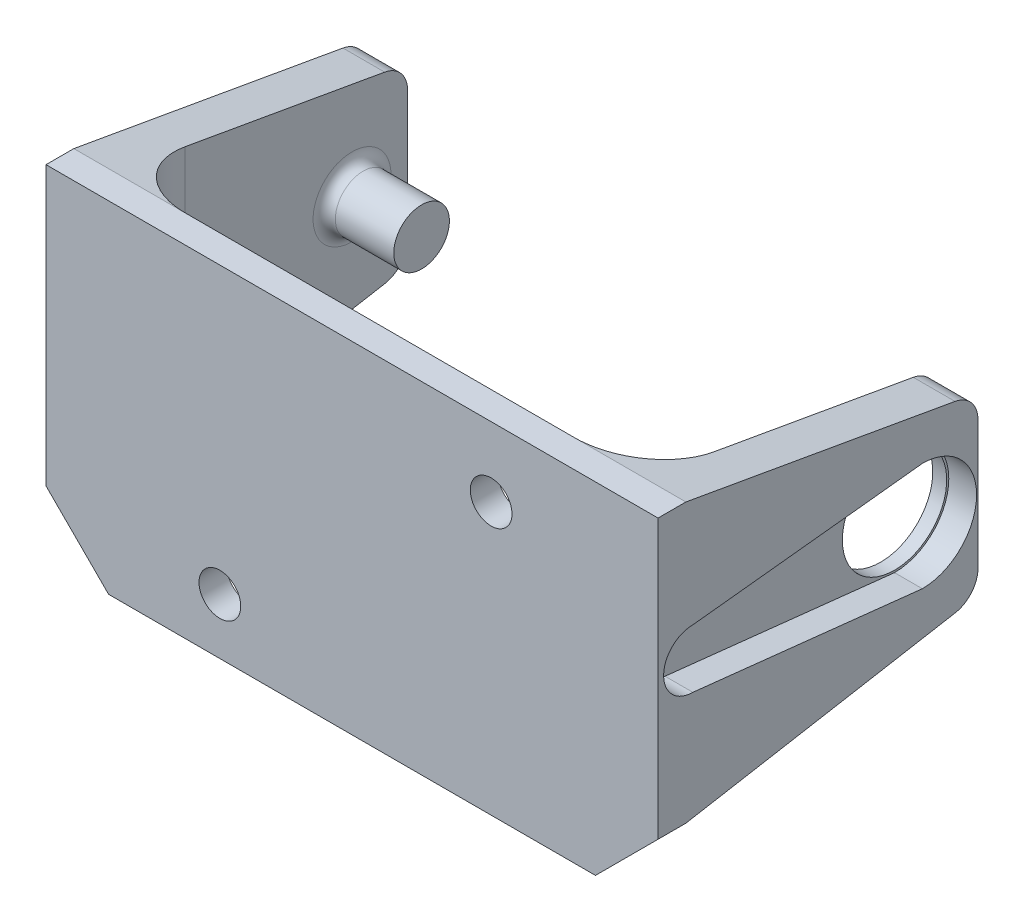
ISO-10303-21;
HEADER;
FILE_DESCRIPTION(('STEP AP214'),'2;1');
FILE_NAME('part.step','',(''),(''),'','','');
FILE_SCHEMA(('AUTOMOTIVE_DESIGN { 1 0 10303 214 1 1 1 1 }'));
ENDSEC;
DATA;
#1=APPLICATION_CONTEXT('core data for automotive mechanical design processes');
#2=APPLICATION_PROTOCOL_DEFINITION('international standard','automotive_design',2000,#1);
#3=PRODUCT_CONTEXT('',#1,'mechanical');
#4=PRODUCT('Part','Part','',(#3));
#5=PRODUCT_RELATED_PRODUCT_CATEGORY('part','',(#4));
#6=PRODUCT_DEFINITION_FORMATION('','',#4);
#7=PRODUCT_DEFINITION_CONTEXT('part definition',#1,'design');
#8=PRODUCT_DEFINITION('design','',#6,#7);
#9=PRODUCT_DEFINITION_SHAPE('','',#8);
#10=(LENGTH_UNIT() NAMED_UNIT(*) SI_UNIT(.MILLI.,.METRE.));
#11=(NAMED_UNIT(*) PLANE_ANGLE_UNIT() SI_UNIT($,.RADIAN.));
#12=(NAMED_UNIT(*) SI_UNIT($,.STERADIAN.) SOLID_ANGLE_UNIT());
#13=UNCERTAINTY_MEASURE_WITH_UNIT(LENGTH_MEASURE(1.E-05),#10,'distance_accuracy_value','');
#14=(GEOMETRIC_REPRESENTATION_CONTEXT(3) GLOBAL_UNCERTAINTY_ASSIGNED_CONTEXT((#13)) GLOBAL_UNIT_ASSIGNED_CONTEXT((#10,
#11,#12)) REPRESENTATION_CONTEXT('',''));
#15=CARTESIAN_POINT('',(0.,0.,0.));
#16=DIRECTION('',(0.,0.,1.));
#17=DIRECTION('',(1.,0.,0.));
#18=AXIS2_PLACEMENT_3D('',#15,#16,#17);
#19=CARTESIAN_POINT('',(22.,4.61893414276776,-19.));
#20=DIRECTION('',(-1.,0.,0.));
#21=DIRECTION('',(0.,0.,1.));
#22=AXIS2_PLACEMENT_3D('',#19,#20,#21);
#23=PLANE('',#22);
#24=DIRECTION('',(0.,-1.,0.));
#25=VECTOR('',#24,1.);
#26=CARTESIAN_POINT('',(22.,-10.,2.));
#27=LINE('',#26,#25);
#28=CARTESIAN_POINT('',(22.,10.,2.));
#29=VERTEX_POINT('',#28);
#30=CARTESIAN_POINT('',(22.,-10.,2.));
#31=VERTEX_POINT('',#30);
#32=EDGE_CURVE('E172',#29,#31,#27,.T.);
#33=ORIENTED_EDGE('',*,*,#32,.T.);
#34=DIRECTION('',(0.,0.,-1.));
#35=VECTOR('',#34,1.);
#36=CARTESIAN_POINT('',(22.,-10.,0.));
#37=LINE('',#36,#35);
#38=CARTESIAN_POINT('',(22.,-10.,0.));
#39=VERTEX_POINT('',#38);
#40=EDGE_CURVE('E255',#31,#39,#37,.T.);
#41=ORIENTED_EDGE('',*,*,#40,.T.);
#42=DIRECTION('',(0.,0.173648177666927,-0.984807753012209));
#43=VECTOR('',#42,1.);
#44=CARTESIAN_POINT('',(22.,-6.58854964879215,-19.3472963553338));
#45=LINE('',#44,#43);
#46=CARTESIAN_POINT('',(22.,-6.58854964879215,-19.3472963553338));
#47=VERTEX_POINT('',#46);
#48=EDGE_CURVE('E252',#39,#47,#45,.T.);
#49=ORIENTED_EDGE('',*,*,#48,.T.);
#50=CARTESIAN_POINT('',(22.,-4.61893414276774,-19.));
#51=DIRECTION('',(1.,0.,0.));
#52=DIRECTION('',(0.,0.,1.));
#53=AXIS2_PLACEMENT_3D('',#50,#51,#52);
#54=CIRCLE('',#53,2.);
#55=CARTESIAN_POINT('',(22.,-4.61893414276774,-21.));
#56=VERTEX_POINT('',#55);
#57=EDGE_CURVE('E249',#47,#56,#54,.T.);
#58=ORIENTED_EDGE('',*,*,#57,.T.);
#59=DIRECTION('',(0.,1.,0.));
#60=VECTOR('',#59,1.);
#61=CARTESIAN_POINT('',(22.,4.61893414276776,-21.));
#62=LINE('',#61,#60);
#63=CARTESIAN_POINT('',(22.,4.61893414276776,-21.));
#64=VERTEX_POINT('',#63);
#65=EDGE_CURVE('E246',#56,#64,#62,.T.);
#66=ORIENTED_EDGE('',*,*,#65,.T.);
#67=CARTESIAN_POINT('',(22.,4.61893414276776,-19.));
#68=DIRECTION('',(1.,0.,0.));
#69=DIRECTION('',(0.,0.,1.));
#70=AXIS2_PLACEMENT_3D('',#67,#68,#69);
#71=CIRCLE('',#70,2.);
#72=CARTESIAN_POINT('',(22.,6.58854964879218,-19.3472963553338));
#73=VERTEX_POINT('',#72);
#74=EDGE_CURVE('E243',#64,#73,#71,.T.);
#75=ORIENTED_EDGE('',*,*,#74,.T.);
#76=DIRECTION('',(0.,0.173648177666926,0.984807753012209));
#77=VECTOR('',#76,1.);
#78=CARTESIAN_POINT('',(22.,10.,0.));
#79=LINE('',#78,#77);
#80=CARTESIAN_POINT('',(22.,10.,0.));
#81=VERTEX_POINT('',#80);
#82=EDGE_CURVE('E240',#73,#81,#79,.T.);
#83=ORIENTED_EDGE('',*,*,#82,.T.);
#84=DIRECTION('',(0.,0.,1.));
#85=VECTOR('',#84,1.);
#86=CARTESIAN_POINT('',(22.,10.,2.));
#87=LINE('',#86,#85);
#88=EDGE_CURVE('E166',#81,#29,#87,.T.);
#89=ORIENTED_EDGE('',*,*,#88,.T.);
#90=EDGE_LOOP('',(#33,#41,#49,#58,#66,#75,#83,#89));
#91=FACE_BOUND('',#90,.T.);
#92=DIRECTION('',(0.,-0.108447510175418,-0.994102176607995));
#93=VECTOR('',#92,1.);
#94=CARTESIAN_POINT('',(22.,-2.02139823587063,0.220516171185887));
#95=LINE('',#94,#93);
#96=CARTESIAN_POINT('',(22.,-2.1,-0.499999999999997));
#97=VERTEX_POINT('',#96);
#98=CARTESIAN_POINT('',(22.,-3.9,-17.));
#99=VERTEX_POINT('',#98);
#100=EDGE_CURVE('E321',#97,#99,#95,.T.);
#101=ORIENTED_EDGE('',*,*,#100,.F.);
#102=CARTESIAN_POINT('',(22.,0.,-0.499999999999997));
#103=DIRECTION('',(-1.,0.,0.));
#104=DIRECTION('',(0.,0.,1.));
#105=AXIS2_PLACEMENT_3D('',#102,#103,#104);
#106=CIRCLE('',#105,2.1);
#107=CARTESIAN_POINT('',(22.,2.1,-0.499999999999997));
#108=VERTEX_POINT('',#107);
#109=EDGE_CURVE('E340',#97,#108,#106,.T.);
#110=ORIENTED_EDGE('',*,*,#109,.T.);
#111=DIRECTION('',(0.,-0.108447510175418,0.994102176607995));
#112=VECTOR('',#111,1.);
#113=CARTESIAN_POINT('',(22.,2.02139823587063,0.220516171185887));
#114=LINE('',#113,#112);
#115=CARTESIAN_POINT('',(22.,3.9,-17.));
#116=VERTEX_POINT('',#115);
#117=EDGE_CURVE('E346',#116,#108,#114,.T.);
#118=ORIENTED_EDGE('',*,*,#117,.F.);
#119=CARTESIAN_POINT('',(22.,0.,-17.));
#120=DIRECTION('',(-1.,0.,0.));
#121=DIRECTION('',(0.,0.,1.));
#122=AXIS2_PLACEMENT_3D('',#119,#120,#121);
#123=CIRCLE('',#122,3.9);
#124=EDGE_CURVE('E343',#116,#99,#123,.T.);
#125=ORIENTED_EDGE('',*,*,#124,.T.);
#126=EDGE_LOOP('',(#101,#110,#118,#125));
#127=FACE_BOUND('',#126,.T.);
#128=ADVANCED_FACE('F68',(#91,#127),#23,.F.);
#129=CARTESIAN_POINT('',(0.,0.,2.));
#130=DIRECTION('',(0.,0.,-1.));
#131=DIRECTION('',(-1.,0.,0.));
#132=AXIS2_PLACEMENT_3D('',#129,#130,#131);
#133=PLANE('',#132);
#134=CARTESIAN_POINT('',(10.,5.,2.));
#135=DIRECTION('',(0.,0.,-1.));
#136=DIRECTION('',(-1.,0.,0.));
#137=AXIS2_PLACEMENT_3D('',#134,#135,#136);
#138=CIRCLE('',#137,1.5);
#139=CARTESIAN_POINT('',(8.5,5.,2.));
#140=VERTEX_POINT('',#139);
#141=EDGE_CURVE('E361',#140,#140,#138,.T.);
#142=ORIENTED_EDGE('',*,*,#141,.T.);
#143=EDGE_LOOP('',(#142));
#144=FACE_BOUND('',#143,.T.);
#145=CARTESIAN_POINT('',(-9.50000000000001,-10.5,2.));
#146=DIRECTION('',(0.,0.,-1.));
#147=DIRECTION('',(-1.,0.,0.));
#148=AXIS2_PLACEMENT_3D('',#145,#146,#147);
#149=CIRCLE('',#148,1.5);
#150=CARTESIAN_POINT('',(-11.,-10.5,2.));
#151=VERTEX_POINT('',#150);
#152=EDGE_CURVE('E365',#151,#151,#149,.T.);
#153=ORIENTED_EDGE('',*,*,#152,.T.);
#154=EDGE_LOOP('',(#153));
#155=FACE_BOUND('',#154,.T.);
#156=ORIENTED_EDGE('',*,*,#32,.F.);
#157=DIRECTION('',(-1.,0.,0.));
#158=VECTOR('',#157,1.);
#159=CARTESIAN_POINT('',(-22.,10.,2.));
#160=LINE('',#159,#158);
#161=CARTESIAN_POINT('',(-22.,10.,2.));
#162=VERTEX_POINT('',#161);
#163=EDGE_CURVE('E353',#29,#162,#160,.T.);
#164=ORIENTED_EDGE('',*,*,#163,.T.);
#165=DIRECTION('',(0.,-1.,0.));
#166=VECTOR('',#165,1.);
#167=CARTESIAN_POINT('',(-22.,-10.,2.));
#168=LINE('',#167,#166);
#169=CARTESIAN_POINT('',(-22.,-10.,2.));
#170=VERTEX_POINT('',#169);
#171=EDGE_CURVE('E201',#162,#170,#168,.T.);
#172=ORIENTED_EDGE('',*,*,#171,.T.);
#173=DIRECTION('',(-0.707106781186551,0.707106781186544,0.));
#174=VECTOR('',#173,1.);
#175=CARTESIAN_POINT('',(-17.5,-14.4999999999999,2.));
#176=LINE('',#175,#174);
#177=CARTESIAN_POINT('',(-17.5,-14.4999999999999,2.));
#178=VERTEX_POINT('',#177);
#179=EDGE_CURVE('E299',#178,#170,#176,.T.);
#180=ORIENTED_EDGE('',*,*,#179,.F.);
#181=DIRECTION('',(-1.,0.,0.));
#182=VECTOR('',#181,1.);
#183=CARTESIAN_POINT('',(17.5,-14.5,2.));
#184=LINE('',#183,#182);
#185=CARTESIAN_POINT('',(17.5,-14.5,2.));
#186=VERTEX_POINT('',#185);
#187=EDGE_CURVE('E312',#186,#178,#184,.T.);
#188=ORIENTED_EDGE('',*,*,#187,.F.);
#189=DIRECTION('',(-0.707106781186551,-0.707106781186544,0.));
#190=VECTOR('',#189,1.);
#191=CARTESIAN_POINT('',(22.,-10.,2.));
#192=LINE('',#191,#190);
#193=EDGE_CURVE('E303',#31,#186,#192,.T.);
#194=ORIENTED_EDGE('',*,*,#193,.F.);
#195=EDGE_LOOP('',(#156,#164,#172,#180,#188,#194));
#196=FACE_BOUND('',#195,.T.);
#197=ADVANCED_FACE('F383',(#144,#155,#196),#133,.F.);
#198=CARTESIAN_POINT('',(0.,0.,0.));
#199=DIRECTION('',(0.,0.,-1.));
#200=DIRECTION('',(-1.,0.,0.));
#201=AXIS2_PLACEMENT_3D('',#198,#199,#200);
#202=PLANE('',#201);
#203=CARTESIAN_POINT('',(10.,5.,0.));
#204=DIRECTION('',(0.,0.,-1.));
#205=DIRECTION('',(-1.,0.,0.));
#206=AXIS2_PLACEMENT_3D('',#203,#204,#205);
#207=CIRCLE('',#206,1.5);
#208=CARTESIAN_POINT('',(8.5,5.,0.));
#209=VERTEX_POINT('',#208);
#210=EDGE_CURVE('E370',#209,#209,#207,.T.);
#211=ORIENTED_EDGE('',*,*,#210,.F.);
#212=EDGE_LOOP('',(#211));
#213=FACE_BOUND('',#212,.T.);
#214=CARTESIAN_POINT('',(-9.50000000000001,-10.5,0.));
#215=DIRECTION('',(0.,0.,-1.));
#216=DIRECTION('',(-1.,0.,0.));
#217=AXIS2_PLACEMENT_3D('',#214,#215,#216);
#218=CIRCLE('',#217,1.5);
#219=CARTESIAN_POINT('',(-11.,-10.5,0.));
#220=VERTEX_POINT('',#219);
#221=EDGE_CURVE('E371',#220,#220,#218,.T.);
#222=ORIENTED_EDGE('',*,*,#221,.F.);
#223=EDGE_LOOP('',(#222));
#224=FACE_BOUND('',#223,.T.);
#225=DIRECTION('',(1.,0.,0.));
#226=VECTOR('',#225,1.);
#227=CARTESIAN_POINT('',(-22.,-10.,0.));
#228=LINE('',#227,#226);
#229=CARTESIAN_POINT('',(-22.,-10.,0.));
#230=VERTEX_POINT('',#229);
#231=CARTESIAN_POINT('',(-14.,-10.,0.));
#232=VERTEX_POINT('',#231);
#233=EDGE_CURVE('E124',#230,#232,#228,.T.);
#234=ORIENTED_EDGE('',*,*,#233,.T.);
#235=DIRECTION('',(0.,-1.,0.));
#236=VECTOR('',#235,1.);
#237=CARTESIAN_POINT('',(-14.,10.,0.));
#238=LINE('',#237,#236);
#239=CARTESIAN_POINT('',(-14.,10.,0.));
#240=VERTEX_POINT('',#239);
#241=EDGE_CURVE('E126',#232,#240,#238,.F.);
#242=ORIENTED_EDGE('',*,*,#241,.T.);
#243=DIRECTION('',(-1.,0.,0.));
#244=VECTOR('',#243,1.);
#245=CARTESIAN_POINT('',(-22.,10.,0.));
#246=LINE('',#245,#244);
#247=CARTESIAN_POINT('',(14.,10.,0.));
#248=VERTEX_POINT('',#247);
#249=EDGE_CURVE('E357',#248,#240,#246,.T.);
#250=ORIENTED_EDGE('',*,*,#249,.F.);
#251=DIRECTION('',(0.,1.,0.));
#252=VECTOR('',#251,1.);
#253=CARTESIAN_POINT('',(14.,-10.,0.));
#254=LINE('',#253,#252);
#255=CARTESIAN_POINT('',(14.,-10.,0.));
#256=VERTEX_POINT('',#255);
#257=EDGE_CURVE('E147',#248,#256,#254,.F.);
#258=ORIENTED_EDGE('',*,*,#257,.T.);
#259=DIRECTION('',(-1.,0.,0.));
#260=VECTOR('',#259,1.);
#261=CARTESIAN_POINT('',(22.,-10.,0.));
#262=LINE('',#261,#260);
#263=EDGE_CURVE('E196',#39,#256,#262,.T.);
#264=ORIENTED_EDGE('',*,*,#263,.F.);
#265=DIRECTION('',(-0.707106781186551,-0.707106781186544,0.));
#266=VECTOR('',#265,1.);
#267=CARTESIAN_POINT('',(22.,-10.,0.));
#268=LINE('',#267,#266);
#269=CARTESIAN_POINT('',(17.5,-14.5,0.));
#270=VERTEX_POINT('',#269);
#271=EDGE_CURVE('E306',#39,#270,#268,.T.);
#272=ORIENTED_EDGE('',*,*,#271,.T.);
#273=DIRECTION('',(-1.,0.,0.));
#274=VECTOR('',#273,1.);
#275=CARTESIAN_POINT('',(17.5,-14.5,0.));
#276=LINE('',#275,#274);
#277=CARTESIAN_POINT('',(-17.5,-14.4999999999999,0.));
#278=VERTEX_POINT('',#277);
#279=EDGE_CURVE('E304',#270,#278,#276,.T.);
#280=ORIENTED_EDGE('',*,*,#279,.T.);
#281=DIRECTION('',(-0.707106781186551,0.707106781186544,0.));
#282=VECTOR('',#281,1.);
#283=CARTESIAN_POINT('',(-17.5,-14.4999999999999,0.));
#284=LINE('',#283,#282);
#285=EDGE_CURVE('E130',#278,#230,#284,.T.);
#286=ORIENTED_EDGE('',*,*,#285,.T.);
#287=EDGE_LOOP('',(#234,#242,#250,#258,#264,#272,#280,#286));
#288=FACE_BOUND('',#287,.T.);
#289=ADVANCED_FACE('F125',(#213,#224,#288),#202,.T.);
#290=CARTESIAN_POINT('',(22.,-6.58854964879215,-19.3472963553338));
#291=DIRECTION('',(0.,0.984807753012208,0.173648177666927));
#292=DIRECTION('',(0.,-0.173648177666927,0.984807753012209));
#293=AXIS2_PLACEMENT_3D('',#290,#291,#292);
#294=PLANE('',#293);
#295=ORIENTED_EDGE('',*,*,#263,.T.);
#296=CARTESIAN_POINT('',(14.,-9.11836509645769,-5.));
#297=DIRECTION('',(0.,0.984807753012208,0.173648177666927));
#298=DIRECTION('',(0.,-0.173648177666927,0.984807753012209));
#299=AXIS2_PLACEMENT_3D('',#296,#297,#298);
#300=ELLIPSE('',#299,5.07713305942872,5.);
#301=CARTESIAN_POINT('',(19.,-9.11836509645769,-5.));
#302=VERTEX_POINT('',#301);
#303=EDGE_CURVE('E12',#256,#302,#300,.T.);
#304=ORIENTED_EDGE('',*,*,#303,.T.);
#305=DIRECTION('',(0.,0.173648177666927,-0.984807753012209));
#306=VECTOR('',#305,1.);
#307=CARTESIAN_POINT('',(19.,-6.58854964879215,-19.3472963553338));
#308=LINE('',#307,#306);
#309=CARTESIAN_POINT('',(19.,-6.58854964879215,-19.3472963553338));
#310=VERTEX_POINT('',#309);
#311=EDGE_CURVE('E155',#302,#310,#308,.T.);
#312=ORIENTED_EDGE('',*,*,#311,.T.);
#313=DIRECTION('',(-1.,0.,0.));
#314=VECTOR('',#313,1.);
#315=CARTESIAN_POINT('',(22.,-6.58854964879215,-19.3472963553338));
#316=LINE('',#315,#314);
#317=EDGE_CURVE('E205',#47,#310,#316,.T.);
#318=ORIENTED_EDGE('',*,*,#317,.F.);
#319=ORIENTED_EDGE('',*,*,#48,.F.);
#320=EDGE_LOOP('',(#295,#304,#312,#318,#319));
#321=FACE_BOUND('',#320,.T.);
#322=ADVANCED_FACE('F382',(#321),#294,.F.);
#323=CARTESIAN_POINT('',(22.,-4.61893414276774,-19.));
#324=DIRECTION('',(-1.,0.,0.));
#325=DIRECTION('',(0.,0.,1.));
#326=AXIS2_PLACEMENT_3D('',#323,#324,#325);
#327=CYLINDRICAL_SURFACE('',#326,2.);
#328=CARTESIAN_POINT('',(19.,-4.61893414276774,-19.));
#329=DIRECTION('',(1.,0.,0.));
#330=DIRECTION('',(0.,0.,1.));
#331=AXIS2_PLACEMENT_3D('',#328,#329,#330);
#332=CIRCLE('',#331,2.);
#333=CARTESIAN_POINT('',(19.,-4.61893414276774,-21.));
#334=VERTEX_POINT('',#333);
#335=EDGE_CURVE('E158',#310,#334,#332,.T.);
#336=ORIENTED_EDGE('',*,*,#335,.T.);
#337=DIRECTION('',(-1.,0.,0.));
#338=VECTOR('',#337,1.);
#339=CARTESIAN_POINT('',(22.,-4.61893414276774,-21.));
#340=LINE('',#339,#338);
#341=EDGE_CURVE('E213',#56,#334,#340,.T.);
#342=ORIENTED_EDGE('',*,*,#341,.F.);
#343=ORIENTED_EDGE('',*,*,#57,.F.);
#344=ORIENTED_EDGE('',*,*,#317,.T.);
#345=EDGE_LOOP('',(#336,#342,#343,#344));
#346=FACE_BOUND('',#345,.T.);
#347=ADVANCED_FACE('F533',(#346),#327,.T.);
#348=CARTESIAN_POINT('',(22.,4.61893414276776,-21.));
#349=DIRECTION('',(0.,0.,1.));
#350=DIRECTION('',(0.,-1.,0.));
#351=AXIS2_PLACEMENT_3D('',#348,#349,#350);
#352=PLANE('',#351);
#353=DIRECTION('',(0.,1.,0.));
#354=VECTOR('',#353,1.);
#355=CARTESIAN_POINT('',(19.,4.61893414276776,-21.));
#356=LINE('',#355,#354);
#357=CARTESIAN_POINT('',(19.,4.61893414276776,-21.));
#358=VERTEX_POINT('',#357);
#359=EDGE_CURVE('E235',#334,#358,#356,.T.);
#360=ORIENTED_EDGE('',*,*,#359,.T.);
#361=DIRECTION('',(-1.,0.,0.));
#362=VECTOR('',#361,1.);
#363=CARTESIAN_POINT('',(22.,4.61893414276776,-21.));
#364=LINE('',#363,#362);
#365=EDGE_CURVE('E221',#64,#358,#364,.T.);
#366=ORIENTED_EDGE('',*,*,#365,.F.);
#367=ORIENTED_EDGE('',*,*,#65,.F.);
#368=ORIENTED_EDGE('',*,*,#341,.T.);
#369=EDGE_LOOP('',(#360,#366,#367,#368));
#370=FACE_BOUND('',#369,.T.);
#371=ADVANCED_FACE('F535',(#370),#352,.F.);
#372=CARTESIAN_POINT('',(22.,4.61893414276776,-19.));
#373=DIRECTION('',(-1.,0.,0.));
#374=DIRECTION('',(0.,0.,1.));
#375=AXIS2_PLACEMENT_3D('',#372,#373,#374);
#376=CYLINDRICAL_SURFACE('',#375,2.);
#377=CARTESIAN_POINT('',(19.,4.61893414276776,-19.));
#378=DIRECTION('',(1.,0.,0.));
#379=DIRECTION('',(0.,0.,1.));
#380=AXIS2_PLACEMENT_3D('',#377,#378,#379);
#381=CIRCLE('',#380,2.);
#382=CARTESIAN_POINT('',(19.,6.58854964879218,-19.3472963553338));
#383=VERTEX_POINT('',#382);
#384=EDGE_CURVE('E173',#358,#383,#381,.T.);
#385=ORIENTED_EDGE('',*,*,#384,.T.);
#386=DIRECTION('',(-1.,0.,0.));
#387=VECTOR('',#386,1.);
#388=CARTESIAN_POINT('',(22.,6.58854964879218,-19.3472963553338));
#389=LINE('',#388,#387);
#390=EDGE_CURVE('E165',#73,#383,#389,.T.);
#391=ORIENTED_EDGE('',*,*,#390,.F.);
#392=ORIENTED_EDGE('',*,*,#74,.F.);
#393=ORIENTED_EDGE('',*,*,#365,.T.);
#394=EDGE_LOOP('',(#385,#391,#392,#393));
#395=FACE_BOUND('',#394,.T.);
#396=ADVANCED_FACE('F539',(#395),#376,.T.);
#397=CARTESIAN_POINT('',(22.,10.,0.));
#398=DIRECTION('',(0.,-0.984807753012209,0.173648177666926));
#399=DIRECTION('',(0.,-0.173648177666926,-0.984807753012209));
#400=AXIS2_PLACEMENT_3D('',#397,#398,#399);
#401=PLANE('',#400);
#402=DIRECTION('',(0.,0.173648177666926,0.984807753012209));
#403=VECTOR('',#402,1.);
#404=CARTESIAN_POINT('',(19.,10.,0.));
#405=LINE('',#404,#403);
#406=CARTESIAN_POINT('',(19.,9.1183650964577,-5.));
#407=VERTEX_POINT('',#406);
#408=EDGE_CURVE('E169',#383,#407,#405,.T.);
#409=ORIENTED_EDGE('',*,*,#408,.T.);
#410=CARTESIAN_POINT('',(14.,9.1183650964577,-5.));
#411=DIRECTION('',(0.,-0.984807753012209,0.173648177666926));
#412=DIRECTION('',(0.,-0.173648177666926,-0.984807753012209));
#413=AXIS2_PLACEMENT_3D('',#410,#411,#412);
#414=ELLIPSE('',#413,5.07713305942872,5.);
#415=EDGE_CURVE('E76',#407,#248,#414,.T.);
#416=ORIENTED_EDGE('',*,*,#415,.T.);
#417=DIRECTION('',(-1.,0.,0.));
#418=VECTOR('',#417,1.);
#419=CARTESIAN_POINT('',(22.,10.,0.));
#420=LINE('',#419,#418);
#421=EDGE_CURVE('E83',#81,#248,#420,.T.);
#422=ORIENTED_EDGE('',*,*,#421,.F.);
#423=ORIENTED_EDGE('',*,*,#82,.F.);
#424=ORIENTED_EDGE('',*,*,#390,.T.);
#425=EDGE_LOOP('',(#409,#416,#422,#423,#424));
#426=FACE_BOUND('',#425,.T.);
#427=ADVANCED_FACE('F525',(#426),#401,.F.);
#428=CARTESIAN_POINT('',(19.,4.61893414276776,-19.));
#429=DIRECTION('',(-1.,0.,0.));
#430=DIRECTION('',(0.,0.,1.));
#431=AXIS2_PLACEMENT_3D('',#428,#429,#430);
#432=PLANE('',#431);
#433=CARTESIAN_POINT('',(19.,0.,-17.));
#434=DIRECTION('',(-1.,0.,0.));
#435=DIRECTION('',(0.,0.,1.));
#436=AXIS2_PLACEMENT_3D('',#433,#434,#435);
#437=CIRCLE('',#436,3.75);
#438=CARTESIAN_POINT('',(19.,0.,-13.25));
#439=VERTEX_POINT('',#438);
#440=EDGE_CURVE('E191',#439,#439,#437,.T.);
#441=ORIENTED_EDGE('',*,*,#440,.F.);
#442=EDGE_LOOP('',(#441));
#443=FACE_BOUND('',#442,.T.);
#444=ORIENTED_EDGE('',*,*,#311,.F.);
#445=DIRECTION('',(0.,1.,0.));
#446=VECTOR('',#445,1.);
#447=CARTESIAN_POINT('',(19.,10.,-5.));
#448=LINE('',#447,#446);
#449=EDGE_CURVE('E143',#302,#407,#448,.T.);
#450=ORIENTED_EDGE('',*,*,#449,.T.);
#451=ORIENTED_EDGE('',*,*,#408,.F.);
#452=ORIENTED_EDGE('',*,*,#384,.F.);
#453=ORIENTED_EDGE('',*,*,#359,.F.);
#454=ORIENTED_EDGE('',*,*,#335,.F.);
#455=EDGE_LOOP('',(#444,#450,#451,#452,#453,#454));
#456=FACE_BOUND('',#455,.T.);
#457=ADVANCED_FACE('F531',(#443,#456),#432,.T.);
#458=CARTESIAN_POINT('',(-22.,10.,0.));
#459=DIRECTION('',(0.,0.984807753012209,-0.173648177666926));
#460=DIRECTION('',(0.,0.173648177666926,0.984807753012209));
#461=AXIS2_PLACEMENT_3D('',#458,#459,#460);
#462=PLANE('',#461);
#463=DIRECTION('',(0.,0.173648177666926,0.984807753012209));
#464=VECTOR('',#463,1.);
#465=CARTESIAN_POINT('',(-19.,10.,0.));
#466=LINE('',#465,#464);
#467=CARTESIAN_POINT('',(-19.,6.58854964879218,-19.3472963553338));
#468=VERTEX_POINT('',#467);
#469=CARTESIAN_POINT('',(-19.,9.1183650964577,-5.));
#470=VERTEX_POINT('',#469);
#471=EDGE_CURVE('E180',#468,#470,#466,.T.);
#472=ORIENTED_EDGE('',*,*,#471,.F.);
#473=DIRECTION('',(1.,0.,0.));
#474=VECTOR('',#473,1.);
#475=CARTESIAN_POINT('',(-22.,6.58854964879218,-19.3472963553338));
#476=LINE('',#475,#474);
#477=CARTESIAN_POINT('',(-22.,6.58854964879218,-19.3472963553338));
#478=VERTEX_POINT('',#477);
#479=EDGE_CURVE('E177',#478,#468,#476,.T.);
#480=ORIENTED_EDGE('',*,*,#479,.F.);
#481=DIRECTION('',(0.,0.173648177666926,0.984807753012209));
#482=VECTOR('',#481,1.);
#483=CARTESIAN_POINT('',(-22.,10.,0.));
#484=LINE('',#483,#482);
#485=CARTESIAN_POINT('',(-22.,10.,0.));
#486=VERTEX_POINT('',#485);
#487=EDGE_CURVE('E289',#478,#486,#484,.T.);
#488=ORIENTED_EDGE('',*,*,#487,.T.);
#489=DIRECTION('',(1.,0.,0.));
#490=VECTOR('',#489,1.);
#491=CARTESIAN_POINT('',(-22.,10.,0.));
#492=LINE('',#491,#490);
#493=EDGE_CURVE('E104',#486,#240,#492,.T.);
#494=ORIENTED_EDGE('',*,*,#493,.T.);
#495=CARTESIAN_POINT('',(-14.,9.1183650964577,-5.));
#496=DIRECTION('',(0.,0.984807753012209,-0.173648177666926));
#497=DIRECTION('',(0.,0.173648177666926,0.984807753012209));
#498=AXIS2_PLACEMENT_3D('',#495,#496,#497);
#499=ELLIPSE('',#498,5.07713305942872,5.);
#500=EDGE_CURVE('E142',#240,#470,#499,.F.);
#501=ORIENTED_EDGE('',*,*,#500,.T.);
#502=EDGE_LOOP('',(#472,#480,#488,#494,#501));
#503=FACE_BOUND('',#502,.T.);
#504=ADVANCED_FACE('F521',(#503),#462,.T.);
#505=CARTESIAN_POINT('',(-22.,4.61893414276776,-19.));
#506=DIRECTION('',(1.,0.,0.));
#507=DIRECTION('',(0.,0.,-1.));
#508=AXIS2_PLACEMENT_3D('',#505,#506,#507);
#509=CYLINDRICAL_SURFACE('',#508,2.);
#510=CARTESIAN_POINT('',(-19.,4.61893414276776,-19.));
#511=DIRECTION('',(1.,0.,0.));
#512=DIRECTION('',(0.,0.,1.));
#513=AXIS2_PLACEMENT_3D('',#510,#511,#512);
#514=CIRCLE('',#513,2.);
#515=CARTESIAN_POINT('',(-19.,4.61893414276776,-21.));
#516=VERTEX_POINT('',#515);
#517=EDGE_CURVE('E183',#516,#468,#514,.T.);
#518=ORIENTED_EDGE('',*,*,#517,.F.);
#519=DIRECTION('',(1.,0.,0.));
#520=VECTOR('',#519,1.);
#521=CARTESIAN_POINT('',(-22.,4.61893414276776,-21.));
#522=LINE('',#521,#520);
#523=CARTESIAN_POINT('',(-22.,4.61893414276776,-21.));
#524=VERTEX_POINT('',#523);
#525=EDGE_CURVE('E262',#524,#516,#522,.T.);
#526=ORIENTED_EDGE('',*,*,#525,.F.);
#527=CARTESIAN_POINT('',(-22.,4.61893414276776,-19.));
#528=DIRECTION('',(1.,0.,0.));
#529=DIRECTION('',(0.,0.,1.));
#530=AXIS2_PLACEMENT_3D('',#527,#528,#529);
#531=CIRCLE('',#530,2.);
#532=EDGE_CURVE('E286',#524,#478,#531,.T.);
#533=ORIENTED_EDGE('',*,*,#532,.T.);
#534=ORIENTED_EDGE('',*,*,#479,.T.);
#535=EDGE_LOOP('',(#518,#526,#533,#534));
#536=FACE_BOUND('',#535,.T.);
#537=ADVANCED_FACE('F560',(#536),#509,.T.);
#538=CARTESIAN_POINT('',(-22.,4.61893414276776,-21.));
#539=DIRECTION('',(0.,0.,-1.));
#540=DIRECTION('',(0.,1.,0.));
#541=AXIS2_PLACEMENT_3D('',#538,#539,#540);
#542=PLANE('',#541);
#543=DIRECTION('',(0.,1.,0.));
#544=VECTOR('',#543,1.);
#545=CARTESIAN_POINT('',(-19.,4.61893414276776,-21.));
#546=LINE('',#545,#544);
#547=CARTESIAN_POINT('',(-19.,-4.61893414276774,-21.));
#548=VERTEX_POINT('',#547);
#549=EDGE_CURVE('E271',#548,#516,#546,.T.);
#550=ORIENTED_EDGE('',*,*,#549,.F.);
#551=DIRECTION('',(1.,0.,0.));
#552=VECTOR('',#551,1.);
#553=CARTESIAN_POINT('',(-22.,-4.61893414276774,-21.));
#554=LINE('',#553,#552);
#555=CARTESIAN_POINT('',(-22.,-4.61893414276774,-21.));
#556=VERTEX_POINT('',#555);
#557=EDGE_CURVE('E265',#556,#548,#554,.T.);
#558=ORIENTED_EDGE('',*,*,#557,.F.);
#559=DIRECTION('',(0.,1.,0.));
#560=VECTOR('',#559,1.);
#561=CARTESIAN_POINT('',(-22.,4.61893414276776,-21.));
#562=LINE('',#561,#560);
#563=EDGE_CURVE('E283',#556,#524,#562,.T.);
#564=ORIENTED_EDGE('',*,*,#563,.T.);
#565=ORIENTED_EDGE('',*,*,#525,.T.);
#566=EDGE_LOOP('',(#550,#558,#564,#565));
#567=FACE_BOUND('',#566,.T.);
#568=ADVANCED_FACE('F599',(#567),#542,.T.);
#569=CARTESIAN_POINT('',(-22.,-4.61893414276774,-19.));
#570=DIRECTION('',(1.,0.,0.));
#571=DIRECTION('',(0.,0.,-1.));
#572=AXIS2_PLACEMENT_3D('',#569,#570,#571);
#573=CYLINDRICAL_SURFACE('',#572,2.);
#574=CARTESIAN_POINT('',(-19.,-4.61893414276774,-19.));
#575=DIRECTION('',(1.,0.,0.));
#576=DIRECTION('',(0.,0.,1.));
#577=AXIS2_PLACEMENT_3D('',#574,#575,#576);
#578=CIRCLE('',#577,2.);
#579=CARTESIAN_POINT('',(-19.,-6.58854964879215,-19.3472963553338));
#580=VERTEX_POINT('',#579);
#581=EDGE_CURVE('E202',#580,#548,#578,.T.);
#582=ORIENTED_EDGE('',*,*,#581,.F.);
#583=DIRECTION('',(1.,0.,0.));
#584=VECTOR('',#583,1.);
#585=CARTESIAN_POINT('',(-22.,-6.58854964879215,-19.3472963553338));
#586=LINE('',#585,#584);
#587=CARTESIAN_POINT('',(-22.,-6.58854964879215,-19.3472963553338));
#588=VERTEX_POINT('',#587);
#589=EDGE_CURVE('E134',#588,#580,#586,.T.);
#590=ORIENTED_EDGE('',*,*,#589,.F.);
#591=CARTESIAN_POINT('',(-22.,-4.61893414276774,-19.));
#592=DIRECTION('',(1.,0.,0.));
#593=DIRECTION('',(0.,0.,1.));
#594=AXIS2_PLACEMENT_3D('',#591,#592,#593);
#595=CIRCLE('',#594,2.);
#596=EDGE_CURVE('E280',#588,#556,#595,.T.);
#597=ORIENTED_EDGE('',*,*,#596,.T.);
#598=ORIENTED_EDGE('',*,*,#557,.T.);
#599=EDGE_LOOP('',(#582,#590,#597,#598));
#600=FACE_BOUND('',#599,.T.);
#601=ADVANCED_FACE('F515',(#600),#573,.T.);
#602=CARTESIAN_POINT('',(-22.,-6.58854964879215,-19.3472963553338));
#603=DIRECTION('',(0.,-0.984807753012208,-0.173648177666927));
#604=DIRECTION('',(0.,0.173648177666927,-0.984807753012209));
#605=AXIS2_PLACEMENT_3D('',#602,#603,#604);
#606=PLANE('',#605);
#607=DIRECTION('',(0.,0.173648177666927,-0.984807753012209));
#608=VECTOR('',#607,1.);
#609=CARTESIAN_POINT('',(-19.,-6.58854964879215,-19.3472963553338));
#610=LINE('',#609,#608);
#611=CARTESIAN_POINT('',(-19.,-9.11836509645769,-5.));
#612=VERTEX_POINT('',#611);
#613=EDGE_CURVE('E141',#612,#580,#610,.T.);
#614=ORIENTED_EDGE('',*,*,#613,.F.);
#615=CARTESIAN_POINT('',(-14.,-9.11836509645769,-5.));
#616=DIRECTION('',(0.,-0.984807753012208,-0.173648177666927));
#617=DIRECTION('',(0.,0.173648177666927,-0.984807753012209));
#618=AXIS2_PLACEMENT_3D('',#615,#616,#617);
#619=ELLIPSE('',#618,5.07713305942872,5.);
#620=EDGE_CURVE('E115',#612,#232,#619,.F.);
#621=ORIENTED_EDGE('',*,*,#620,.T.);
#622=ORIENTED_EDGE('',*,*,#233,.F.);
#623=DIRECTION('',(0.,0.173648177666927,-0.984807753012209));
#624=VECTOR('',#623,1.);
#625=CARTESIAN_POINT('',(-22.,-6.58854964879215,-19.3472963553338));
#626=LINE('',#625,#624);
#627=EDGE_CURVE('E278',#230,#588,#626,.T.);
#628=ORIENTED_EDGE('',*,*,#627,.T.);
#629=ORIENTED_EDGE('',*,*,#589,.T.);
#630=EDGE_LOOP('',(#614,#621,#622,#628,#629));
#631=FACE_BOUND('',#630,.T.);
#632=ADVANCED_FACE('F138',(#631),#606,.T.);
#633=CARTESIAN_POINT('',(-22.,4.61893414276776,-19.));
#634=DIRECTION('',(1.,0.,0.));
#635=DIRECTION('',(0.,0.,1.));
#636=AXIS2_PLACEMENT_3D('',#633,#634,#635);
#637=PLANE('',#636);
#638=ORIENTED_EDGE('',*,*,#171,.F.);
#639=DIRECTION('',(0.,0.,1.));
#640=VECTOR('',#639,1.);
#641=CARTESIAN_POINT('',(-22.,10.,2.));
#642=LINE('',#641,#640);
#643=EDGE_CURVE('E291',#486,#162,#642,.T.);
#644=ORIENTED_EDGE('',*,*,#643,.F.);
#645=ORIENTED_EDGE('',*,*,#487,.F.);
#646=ORIENTED_EDGE('',*,*,#532,.F.);
#647=ORIENTED_EDGE('',*,*,#563,.F.);
#648=ORIENTED_EDGE('',*,*,#596,.F.);
#649=ORIENTED_EDGE('',*,*,#627,.F.);
#650=DIRECTION('',(0.,0.,-1.));
#651=VECTOR('',#650,1.);
#652=CARTESIAN_POINT('',(-22.,-10.,0.));
#653=LINE('',#652,#651);
#654=EDGE_CURVE('E135',#170,#230,#653,.T.);
#655=ORIENTED_EDGE('',*,*,#654,.F.);
#656=EDGE_LOOP('',(#638,#644,#645,#646,#647,#648,#649,#655));
#657=FACE_BOUND('',#656,.T.);
#658=ADVANCED_FACE('F510',(#657),#637,.F.);
#659=CARTESIAN_POINT('',(-19.,4.61893414276776,-19.));
#660=DIRECTION('',(1.,0.,0.));
#661=DIRECTION('',(0.,0.,1.));
#662=AXIS2_PLACEMENT_3D('',#659,#660,#661);
#663=PLANE('',#662);
#664=CARTESIAN_POINT('',(-19.,4.96628438738256E-12,-17.0000000000025));
#665=DIRECTION('',(1.,0.,0.));
#666=DIRECTION('',(0.,0.,-1.));
#667=AXIS2_PLACEMENT_3D('',#664,#665,#666);
#668=CIRCLE('',#667,2.80000000000086);
#669=CARTESIAN_POINT('',(-19.,4.96628438738256E-12,-19.8000000000034));
#670=VERTEX_POINT('',#669);
#671=EDGE_CURVE('E195',#670,#670,#668,.F.);
#672=ORIENTED_EDGE('',*,*,#671,.T.);
#673=EDGE_LOOP('',(#672));
#674=FACE_BOUND('',#673,.T.);
#675=ORIENTED_EDGE('',*,*,#471,.T.);
#676=DIRECTION('',(0.,-1.,0.));
#677=VECTOR('',#676,1.);
#678=CARTESIAN_POINT('',(-19.,-10.,-5.));
#679=LINE('',#678,#677);
#680=EDGE_CURVE('E151',#470,#612,#679,.T.);
#681=ORIENTED_EDGE('',*,*,#680,.T.);
#682=ORIENTED_EDGE('',*,*,#613,.T.);
#683=ORIENTED_EDGE('',*,*,#581,.T.);
#684=ORIENTED_EDGE('',*,*,#549,.T.);
#685=ORIENTED_EDGE('',*,*,#517,.T.);
#686=EDGE_LOOP('',(#675,#681,#682,#683,#684,#685));
#687=FACE_BOUND('',#686,.T.);
#688=ADVANCED_FACE('F518',(#674,#687),#663,.T.);
#689=CARTESIAN_POINT('',(-17.5,-14.4999999999999,2.));
#690=DIRECTION('',(-0.707106781186544,-0.707106781186551,0.));
#691=DIRECTION('',(0.707106781186551,-0.707106781186544,0.));
#692=AXIS2_PLACEMENT_3D('',#689,#690,#691);
#693=PLANE('',#692);
#694=ORIENTED_EDGE('',*,*,#285,.F.);
#695=DIRECTION('',(0.,0.,-1.));
#696=VECTOR('',#695,1.);
#697=CARTESIAN_POINT('',(-17.5,-14.4999999999999,2.));
#698=LINE('',#697,#696);
#699=EDGE_CURVE('E184',#178,#278,#698,.T.);
#700=ORIENTED_EDGE('',*,*,#699,.F.);
#701=ORIENTED_EDGE('',*,*,#179,.T.);
#702=ORIENTED_EDGE('',*,*,#654,.T.);
#703=EDGE_LOOP('',(#694,#700,#701,#702));
#704=FACE_BOUND('',#703,.T.);
#705=ADVANCED_FACE('F504',(#704),#693,.T.);
#706=CARTESIAN_POINT('',(17.5,-14.5,2.));
#707=DIRECTION('',(0.,-1.,0.));
#708=DIRECTION('',(1.,0.,0.));
#709=AXIS2_PLACEMENT_3D('',#706,#707,#708);
#710=PLANE('',#709);
#711=ORIENTED_EDGE('',*,*,#279,.F.);
#712=DIRECTION('',(0.,0.,-1.));
#713=VECTOR('',#712,1.);
#714=CARTESIAN_POINT('',(17.5,-14.5,2.));
#715=LINE('',#714,#713);
#716=EDGE_CURVE('E296',#186,#270,#715,.T.);
#717=ORIENTED_EDGE('',*,*,#716,.F.);
#718=ORIENTED_EDGE('',*,*,#187,.T.);
#719=ORIENTED_EDGE('',*,*,#699,.T.);
#720=EDGE_LOOP('',(#711,#717,#718,#719));
#721=FACE_BOUND('',#720,.T.);
#722=ADVANCED_FACE('F506',(#721),#710,.T.);
#723=CARTESIAN_POINT('',(22.,-10.,2.));
#724=DIRECTION('',(0.707106781186544,-0.707106781186552,0.));
#725=DIRECTION('',(0.707106781186552,0.707106781186544,0.));
#726=AXIS2_PLACEMENT_3D('',#723,#724,#725);
#727=PLANE('',#726);
#728=ORIENTED_EDGE('',*,*,#271,.F.);
#729=ORIENTED_EDGE('',*,*,#40,.F.);
#730=ORIENTED_EDGE('',*,*,#193,.T.);
#731=ORIENTED_EDGE('',*,*,#716,.T.);
#732=EDGE_LOOP('',(#728,#729,#730,#731));
#733=FACE_BOUND('',#732,.T.);
#734=ADVANCED_FACE('F415',(#733),#727,.T.);
#735=CARTESIAN_POINT('',(20.,0.,0.));
#736=DIRECTION('',(-1.,0.,0.));
#737=DIRECTION('',(0.,0.,1.));
#738=AXIS2_PLACEMENT_3D('',#735,#736,#737);
#739=PLANE('',#738);
#740=CARTESIAN_POINT('',(20.,0.,-17.));
#741=DIRECTION('',(-1.,0.,0.));
#742=DIRECTION('',(0.,0.,1.));
#743=AXIS2_PLACEMENT_3D('',#740,#741,#742);
#744=CIRCLE('',#743,3.75);
#745=CARTESIAN_POINT('',(20.,0.,-13.25));
#746=VERTEX_POINT('',#745);
#747=EDGE_CURVE('E187',#746,#746,#744,.T.);
#748=ORIENTED_EDGE('',*,*,#747,.T.);
#749=EDGE_LOOP('',(#748));
#750=FACE_BOUND('',#749,.T.);
#751=CARTESIAN_POINT('',(20.,0.,-0.499999999999997));
#752=DIRECTION('',(-1.,0.,0.));
#753=DIRECTION('',(0.,0.,1.));
#754=AXIS2_PLACEMENT_3D('',#751,#752,#753);
#755=CIRCLE('',#754,2.1);
#756=CARTESIAN_POINT('',(20.,-2.1,-0.499999999999997));
#757=VERTEX_POINT('',#756);
#758=CARTESIAN_POINT('',(20.,2.1,-0.499999999999997));
#759=VERTEX_POINT('',#758);
#760=EDGE_CURVE('E332',#757,#759,#755,.T.);
#761=ORIENTED_EDGE('',*,*,#760,.F.);
#762=DIRECTION('',(0.,-0.108447510175418,-0.994102176607995));
#763=VECTOR('',#762,1.);
#764=CARTESIAN_POINT('',(20.,-2.02139823587063,0.220516171185887));
#765=LINE('',#764,#763);
#766=CARTESIAN_POINT('',(20.,-3.9,-17.));
#767=VERTEX_POINT('',#766);
#768=EDGE_CURVE('E329',#757,#767,#765,.T.);
#769=ORIENTED_EDGE('',*,*,#768,.T.);
#770=CARTESIAN_POINT('',(20.,0.,-17.));
#771=DIRECTION('',(-1.,0.,0.));
#772=DIRECTION('',(0.,0.,1.));
#773=AXIS2_PLACEMENT_3D('',#770,#771,#772);
#774=CIRCLE('',#773,3.9);
#775=CARTESIAN_POINT('',(20.,3.9,-17.));
#776=VERTEX_POINT('',#775);
#777=EDGE_CURVE('E333',#776,#767,#774,.T.);
#778=ORIENTED_EDGE('',*,*,#777,.F.);
#779=DIRECTION('',(0.,-0.108447510175418,0.994102176607995));
#780=VECTOR('',#779,1.);
#781=CARTESIAN_POINT('',(20.,2.02139823587063,0.220516171185887));
#782=LINE('',#781,#780);
#783=EDGE_CURVE('E190',#776,#759,#782,.T.);
#784=ORIENTED_EDGE('',*,*,#783,.T.);
#785=EDGE_LOOP('',(#761,#769,#778,#784));
#786=FACE_BOUND('',#785,.T.);
#787=ADVANCED_FACE('F497',(#750,#786),#739,.F.);
#788=CARTESIAN_POINT('',(22.,-2.02139823587063,0.220516171185887));
#789=DIRECTION('',(0.,0.994102176607995,-0.108447510175418));
#790=DIRECTION('',(0.,0.108447510175418,0.994102176607995));
#791=AXIS2_PLACEMENT_3D('',#788,#789,#790);
#792=PLANE('',#791);
#793=ORIENTED_EDGE('',*,*,#768,.F.);
#794=DIRECTION('',(-1.,0.,0.));
#795=VECTOR('',#794,1.);
#796=CARTESIAN_POINT('',(22.,-2.1,-0.499999999999997));
#797=LINE('',#796,#795);
#798=EDGE_CURVE('E309',#97,#757,#797,.T.);
#799=ORIENTED_EDGE('',*,*,#798,.F.);
#800=ORIENTED_EDGE('',*,*,#100,.T.);
#801=DIRECTION('',(-1.,0.,0.));
#802=VECTOR('',#801,1.);
#803=CARTESIAN_POINT('',(22.,-3.9,-17.));
#804=LINE('',#803,#802);
#805=EDGE_CURVE('E324',#99,#767,#804,.T.);
#806=ORIENTED_EDGE('',*,*,#805,.T.);
#807=EDGE_LOOP('',(#793,#799,#800,#806));
#808=FACE_BOUND('',#807,.T.);
#809=ADVANCED_FACE('F480',(#808),#792,.T.);
#810=CARTESIAN_POINT('',(22.,0.,-0.499999999999997));
#811=DIRECTION('',(-1.,0.,0.));
#812=DIRECTION('',(0.,0.,1.));
#813=AXIS2_PLACEMENT_3D('',#810,#811,#812);
#814=CYLINDRICAL_SURFACE('',#813,2.1);
#815=ORIENTED_EDGE('',*,*,#760,.T.);
#816=DIRECTION('',(-1.,0.,0.));
#817=VECTOR('',#816,1.);
#818=CARTESIAN_POINT('',(22.,2.1,-0.499999999999997));
#819=LINE('',#818,#817);
#820=EDGE_CURVE('E317',#108,#759,#819,.T.);
#821=ORIENTED_EDGE('',*,*,#820,.F.);
#822=ORIENTED_EDGE('',*,*,#109,.F.);
#823=ORIENTED_EDGE('',*,*,#798,.T.);
#824=EDGE_LOOP('',(#815,#821,#822,#823));
#825=FACE_BOUND('',#824,.T.);
#826=ADVANCED_FACE('F492',(#825),#814,.F.);
#827=CARTESIAN_POINT('',(22.,2.02139823587063,0.220516171185887));
#828=DIRECTION('',(0.,-0.994102176607995,-0.108447510175418));
#829=DIRECTION('',(0.,0.108447510175418,-0.994102176607995));
#830=AXIS2_PLACEMENT_3D('',#827,#828,#829);
#831=PLANE('',#830);
#832=ORIENTED_EDGE('',*,*,#783,.F.);
#833=DIRECTION('',(-1.,0.,0.));
#834=VECTOR('',#833,1.);
#835=CARTESIAN_POINT('',(22.,3.9,-17.));
#836=LINE('',#835,#834);
#837=EDGE_CURVE('E320',#116,#776,#836,.T.);
#838=ORIENTED_EDGE('',*,*,#837,.F.);
#839=ORIENTED_EDGE('',*,*,#117,.T.);
#840=ORIENTED_EDGE('',*,*,#820,.T.);
#841=EDGE_LOOP('',(#832,#838,#839,#840));
#842=FACE_BOUND('',#841,.T.);
#843=ADVANCED_FACE('F487',(#842),#831,.T.);
#844=CARTESIAN_POINT('',(22.,0.,-17.));
#845=DIRECTION('',(-1.,0.,0.));
#846=DIRECTION('',(0.,0.,1.));
#847=AXIS2_PLACEMENT_3D('',#844,#845,#846);
#848=CYLINDRICAL_SURFACE('',#847,3.9);
#849=ORIENTED_EDGE('',*,*,#777,.T.);
#850=ORIENTED_EDGE('',*,*,#805,.F.);
#851=ORIENTED_EDGE('',*,*,#124,.F.);
#852=ORIENTED_EDGE('',*,*,#837,.T.);
#853=EDGE_LOOP('',(#849,#850,#851,#852));
#854=FACE_BOUND('',#853,.T.);
#855=ADVANCED_FACE('F472',(#854),#848,.F.);
#856=CARTESIAN_POINT('',(21.4,0.,-17.));
#857=DIRECTION('',(-1.,0.,0.));
#858=DIRECTION('',(0.,0.,1.));
#859=AXIS2_PLACEMENT_3D('',#856,#857,#858);
#860=CYLINDRICAL_SURFACE('',#859,3.75);
#861=ORIENTED_EDGE('',*,*,#440,.T.);
#862=EDGE_LOOP('',(#861));
#863=FACE_BOUND('',#862,.T.);
#864=ORIENTED_EDGE('',*,*,#747,.F.);
#865=EDGE_LOOP('',(#864));
#866=FACE_BOUND('',#865,.T.);
#867=ADVANCED_FACE('F563',(#863,#866),#860,.F.);
#868=CARTESIAN_POINT('',(-22.,10.,2.));
#869=DIRECTION('',(0.,-1.,0.));
#870=DIRECTION('',(0.,0.,-1.));
#871=AXIS2_PLACEMENT_3D('',#868,#869,#870);
#872=PLANE('',#871);
#873=ORIENTED_EDGE('',*,*,#421,.T.);
#874=ORIENTED_EDGE('',*,*,#249,.T.);
#875=ORIENTED_EDGE('',*,*,#493,.F.);
#876=ORIENTED_EDGE('',*,*,#643,.T.);
#877=ORIENTED_EDGE('',*,*,#163,.F.);
#878=ORIENTED_EDGE('',*,*,#88,.F.);
#879=EDGE_LOOP('',(#873,#874,#875,#876,#877,#878));
#880=FACE_BOUND('',#879,.T.);
#881=ADVANCED_FACE('F566',(#880),#872,.F.);
#882=CARTESIAN_POINT('',(-14.,4.96628438738256E-12,-17.0000000000025));
#883=DIRECTION('',(-1.,0.,0.));
#884=DIRECTION('',(0.,0.,1.));
#885=AXIS2_PLACEMENT_3D('',#882,#883,#884);
#886=CYLINDRICAL_SURFACE('',#885,2.00000000000086);
#887=CARTESIAN_POINT('',(-18.2,4.96628438738256E-12,-17.0000000000025));
#888=DIRECTION('',(1.,0.,0.));
#889=DIRECTION('',(0.,0.,-1.));
#890=AXIS2_PLACEMENT_3D('',#887,#888,#889);
#891=CIRCLE('',#890,2.00000000000086);
#892=CARTESIAN_POINT('',(-18.2,4.96628438738256E-12,-19.0000000000034));
#893=VERTEX_POINT('',#892);
#894=EDGE_CURVE('E192',#893,#893,#891,.T.);
#895=ORIENTED_EDGE('',*,*,#894,.T.);
#896=EDGE_LOOP('',(#895));
#897=FACE_BOUND('',#896,.T.);
#898=CARTESIAN_POINT('',(-14.,4.96628438738256E-12,-17.0000000000025));
#899=DIRECTION('',(-1.,0.,0.));
#900=DIRECTION('',(0.,0.,1.));
#901=AXIS2_PLACEMENT_3D('',#898,#899,#900);
#902=CIRCLE('',#901,2.00000000000086);
#903=CARTESIAN_POINT('',(-14.,4.96628438738256E-12,-15.0000000000016));
#904=VERTEX_POINT('',#903);
#905=EDGE_CURVE('E358',#904,#904,#902,.T.);
#906=ORIENTED_EDGE('',*,*,#905,.T.);
#907=EDGE_LOOP('',(#906));
#908=FACE_BOUND('',#907,.T.);
#909=ADVANCED_FACE('F610',(#897,#908),#886,.T.);
#910=CARTESIAN_POINT('',(-14.,4.96628438738256E-12,-17.0000000000025));
#911=DIRECTION('',(-1.,0.,0.));
#912=DIRECTION('',(0.,0.,1.));
#913=AXIS2_PLACEMENT_3D('',#910,#911,#912);
#914=PLANE('',#913);
#915=ORIENTED_EDGE('',*,*,#905,.F.);
#916=EDGE_LOOP('',(#915));
#917=FACE_BOUND('',#916,.T.);
#918=ADVANCED_FACE('F614',(#917),#914,.F.);
#919=CARTESIAN_POINT('',(-18.2,4.96628438738256E-12,-17.0000000000025));
#920=DIRECTION('',(1.,0.,0.));
#921=DIRECTION('',(0.,0.,-1.));
#922=AXIS2_PLACEMENT_3D('',#919,#920,#921);
#923=TOROIDAL_SURFACE('',#922,2.80000000000086,0.8);
#924=ORIENTED_EDGE('',*,*,#671,.F.);
#925=EDGE_LOOP('',(#924));
#926=FACE_BOUND('',#925,.T.);
#927=ORIENTED_EDGE('',*,*,#894,.F.);
#928=EDGE_LOOP('',(#927));
#929=FACE_BOUND('',#928,.T.);
#930=ADVANCED_FACE('F619',(#926,#929),#923,.F.);
#931=CARTESIAN_POINT('',(-14.,4.61893414276776,-5.));
#932=DIRECTION('',(0.,1.,0.));
#933=DIRECTION('',(0.,0.,1.));
#934=AXIS2_PLACEMENT_3D('',#931,#932,#933);
#935=CYLINDRICAL_SURFACE('',#934,5.);
#936=ORIENTED_EDGE('',*,*,#500,.F.);
#937=ORIENTED_EDGE('',*,*,#241,.F.);
#938=ORIENTED_EDGE('',*,*,#620,.F.);
#939=ORIENTED_EDGE('',*,*,#680,.F.);
#940=EDGE_LOOP('',(#936,#937,#938,#939));
#941=FACE_BOUND('',#940,.T.);
#942=ADVANCED_FACE('F146',(#941),#935,.F.);
#943=CARTESIAN_POINT('',(14.,4.61893414276776,-5.));
#944=DIRECTION('',(0.,-1.,0.));
#945=DIRECTION('',(0.,0.,-1.));
#946=AXIS2_PLACEMENT_3D('',#943,#944,#945);
#947=CYLINDRICAL_SURFACE('',#946,5.);
#948=ORIENTED_EDGE('',*,*,#303,.F.);
#949=ORIENTED_EDGE('',*,*,#257,.F.);
#950=ORIENTED_EDGE('',*,*,#415,.F.);
#951=ORIENTED_EDGE('',*,*,#449,.F.);
#952=EDGE_LOOP('',(#948,#949,#950,#951));
#953=FACE_BOUND('',#952,.T.);
#954=ADVANCED_FACE('F70',(#953),#947,.F.);
#955=CARTESIAN_POINT('',(-9.50000000000001,-10.5,10.));
#956=DIRECTION('',(0.,0.,-1.));
#957=DIRECTION('',(-1.,0.,0.));
#958=AXIS2_PLACEMENT_3D('',#955,#956,#957);
#959=CYLINDRICAL_SURFACE('',#958,1.5);
#960=ORIENTED_EDGE('',*,*,#221,.T.);
#961=EDGE_LOOP('',(#960));
#962=FACE_BOUND('',#961,.T.);
#963=ORIENTED_EDGE('',*,*,#152,.F.);
#964=EDGE_LOOP('',(#963));
#965=FACE_BOUND('',#964,.T.);
#966=ADVANCED_FACE('F387',(#962,#965),#959,.F.);
#967=CARTESIAN_POINT('',(10.,5.,10.));
#968=DIRECTION('',(0.,0.,-1.));
#969=DIRECTION('',(-1.,0.,0.));
#970=AXIS2_PLACEMENT_3D('',#967,#968,#969);
#971=CYLINDRICAL_SURFACE('',#970,1.5);
#972=ORIENTED_EDGE('',*,*,#210,.T.);
#973=EDGE_LOOP('',(#972));
#974=FACE_BOUND('',#973,.T.);
#975=ORIENTED_EDGE('',*,*,#141,.F.);
#976=EDGE_LOOP('',(#975));
#977=FACE_BOUND('',#976,.T.);
#978=ADVANCED_FACE('F377',(#974,#977),#971,.F.);
#979=CLOSED_SHELL('',(#128,#197,#289,#322,#347,#371,#396,#427,#457,#504,#537,#568,#601,#632,
#658,#688,#705,#722,#734,#787,#809,#826,#843,#855,#867,#881,#909,#918,#930,#942,#954,#966,#978));
#980=MANIFOLD_SOLID_BREP('B2',#979);
#981=ADVANCED_BREP_SHAPE_REPRESENTATION('',(#18,#980),#14);
#982=SHAPE_DEFINITION_REPRESENTATION(#9,#981);
ENDSEC;
END-ISO-10303-21;
